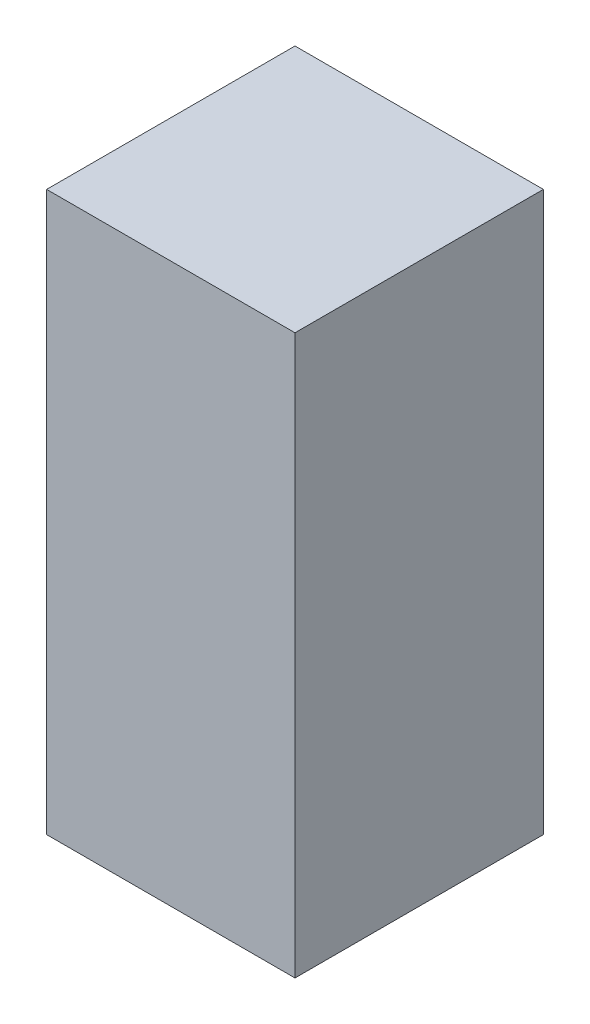
ISO-10303-21;
HEADER;
FILE_DESCRIPTION(('STEP AP214'),'2;1');
FILE_NAME('part.step','',(''),(''),'','','');
FILE_SCHEMA(('AUTOMOTIVE_DESIGN { 1 0 10303 214 1 1 1 1 }'));
ENDSEC;
DATA;
#1=APPLICATION_CONTEXT('core data for automotive mechanical design processes');
#2=APPLICATION_PROTOCOL_DEFINITION('international standard','automotive_design',2000,#1);
#3=PRODUCT_CONTEXT('',#1,'mechanical');
#4=PRODUCT('Part','Part','',(#3));
#5=PRODUCT_RELATED_PRODUCT_CATEGORY('part','',(#4));
#6=PRODUCT_DEFINITION_FORMATION('','',#4);
#7=PRODUCT_DEFINITION_CONTEXT('part definition',#1,'design');
#8=PRODUCT_DEFINITION('design','',#6,#7);
#9=PRODUCT_DEFINITION_SHAPE('','',#8);
#10=(LENGTH_UNIT() NAMED_UNIT(*) SI_UNIT(.MILLI.,.METRE.));
#11=(NAMED_UNIT(*) PLANE_ANGLE_UNIT() SI_UNIT($,.RADIAN.));
#12=(NAMED_UNIT(*) SI_UNIT($,.STERADIAN.) SOLID_ANGLE_UNIT());
#13=UNCERTAINTY_MEASURE_WITH_UNIT(LENGTH_MEASURE(1.E-05),#10,'distance_accuracy_value','');
#14=(GEOMETRIC_REPRESENTATION_CONTEXT(3) GLOBAL_UNCERTAINTY_ASSIGNED_CONTEXT((#13)) GLOBAL_UNIT_ASSIGNED_CONTEXT((#10,
#11,#12)) REPRESENTATION_CONTEXT('',''));
#15=CARTESIAN_POINT('',(0.,0.,0.));
#16=DIRECTION('',(0.,0.,1.));
#17=DIRECTION('',(1.,0.,0.));
#18=AXIS2_PLACEMENT_3D('',#15,#16,#17);
#19=CARTESIAN_POINT('',(-50.,225.,50.));
#20=DIRECTION('',(1.,0.,0.));
#21=DIRECTION('',(0.,0.,-1.));
#22=AXIS2_PLACEMENT_3D('',#19,#20,#21);
#23=PLANE('',#22);
#24=DIRECTION('',(0.,0.,1.));
#25=VECTOR('',#24,1.);
#26=CARTESIAN_POINT('',(-50.,0.,50.));
#27=LINE('',#26,#25);
#28=CARTESIAN_POINT('',(-50.,0.,-50.));
#29=VERTEX_POINT('',#28);
#30=CARTESIAN_POINT('',(-50.,0.,50.));
#31=VERTEX_POINT('',#30);
#32=EDGE_CURVE('E107',#29,#31,#27,.T.);
#33=ORIENTED_EDGE('',*,*,#32,.T.);
#34=DIRECTION('',(0.,-1.,0.));
#35=VECTOR('',#34,1.);
#36=CARTESIAN_POINT('',(-50.,225.,50.));
#37=LINE('',#36,#35);
#38=CARTESIAN_POINT('',(-50.,225.,50.));
#39=VERTEX_POINT('',#38);
#40=EDGE_CURVE('E11',#39,#31,#37,.T.);
#41=ORIENTED_EDGE('',*,*,#40,.F.);
#42=DIRECTION('',(0.,0.,1.));
#43=VECTOR('',#42,1.);
#44=CARTESIAN_POINT('',(-50.,225.,50.));
#45=LINE('',#44,#43);
#46=CARTESIAN_POINT('',(-50.,225.,-50.));
#47=VERTEX_POINT('',#46);
#48=EDGE_CURVE('E91',#47,#39,#45,.T.);
#49=ORIENTED_EDGE('',*,*,#48,.F.);
#50=DIRECTION('',(0.,-1.,0.));
#51=VECTOR('',#50,1.);
#52=CARTESIAN_POINT('',(-50.,225.,-50.));
#53=LINE('',#52,#51);
#54=EDGE_CURVE('E103',#47,#29,#53,.T.);
#55=ORIENTED_EDGE('',*,*,#54,.T.);
#56=EDGE_LOOP('',(#33,#41,#49,#55));
#57=FACE_BOUND('',#56,.T.);
#58=ADVANCED_FACE('F39',(#57),#23,.F.);
#59=CARTESIAN_POINT('',(50.,225.,50.));
#60=DIRECTION('',(0.,0.,-1.));
#61=DIRECTION('',(-1.,0.,0.));
#62=AXIS2_PLACEMENT_3D('',#59,#60,#61);
#63=PLANE('',#62);
#64=DIRECTION('',(1.,0.,0.));
#65=VECTOR('',#64,1.);
#66=CARTESIAN_POINT('',(50.,0.,50.));
#67=LINE('',#66,#65);
#68=CARTESIAN_POINT('',(50.,0.,50.));
#69=VERTEX_POINT('',#68);
#70=EDGE_CURVE('E96',#31,#69,#67,.T.);
#71=ORIENTED_EDGE('',*,*,#70,.T.);
#72=DIRECTION('',(0.,-1.,0.));
#73=VECTOR('',#72,1.);
#74=CARTESIAN_POINT('',(50.,225.,50.));
#75=LINE('',#74,#73);
#76=CARTESIAN_POINT('',(50.,225.,50.));
#77=VERTEX_POINT('',#76);
#78=EDGE_CURVE('E48',#77,#69,#75,.T.);
#79=ORIENTED_EDGE('',*,*,#78,.F.);
#80=DIRECTION('',(1.,0.,0.));
#81=VECTOR('',#80,1.);
#82=CARTESIAN_POINT('',(50.,225.,50.));
#83=LINE('',#82,#81);
#84=EDGE_CURVE('E86',#39,#77,#83,.T.);
#85=ORIENTED_EDGE('',*,*,#84,.F.);
#86=ORIENTED_EDGE('',*,*,#40,.T.);
#87=EDGE_LOOP('',(#71,#79,#85,#86));
#88=FACE_BOUND('',#87,.T.);
#89=ADVANCED_FACE('F95',(#88),#63,.F.);
#90=CARTESIAN_POINT('',(50.,225.,50.));
#91=DIRECTION('',(-1.,0.,0.));
#92=DIRECTION('',(0.,0.,1.));
#93=AXIS2_PLACEMENT_3D('',#90,#91,#92);
#94=PLANE('',#93);
#95=DIRECTION('',(0.,0.,-1.));
#96=VECTOR('',#95,1.);
#97=CARTESIAN_POINT('',(50.,0.,50.));
#98=LINE('',#97,#96);
#99=CARTESIAN_POINT('',(50.,0.,-50.));
#100=VERTEX_POINT('',#99);
#101=EDGE_CURVE('E73',#69,#100,#98,.T.);
#102=ORIENTED_EDGE('',*,*,#101,.T.);
#103=DIRECTION('',(0.,-1.,0.));
#104=VECTOR('',#103,1.);
#105=CARTESIAN_POINT('',(50.,225.,-50.));
#106=LINE('',#105,#104);
#107=CARTESIAN_POINT('',(50.,225.,-50.));
#108=VERTEX_POINT('',#107);
#109=EDGE_CURVE('E98',#108,#100,#106,.T.);
#110=ORIENTED_EDGE('',*,*,#109,.F.);
#111=DIRECTION('',(0.,0.,-1.));
#112=VECTOR('',#111,1.);
#113=CARTESIAN_POINT('',(50.,225.,50.));
#114=LINE('',#113,#112);
#115=EDGE_CURVE('E89',#77,#108,#114,.T.);
#116=ORIENTED_EDGE('',*,*,#115,.F.);
#117=ORIENTED_EDGE('',*,*,#78,.T.);
#118=EDGE_LOOP('',(#102,#110,#116,#117));
#119=FACE_BOUND('',#118,.T.);
#120=ADVANCED_FACE('F99',(#119),#94,.F.);
#121=CARTESIAN_POINT('',(50.,225.,-50.));
#122=DIRECTION('',(0.,0.,1.));
#123=DIRECTION('',(1.,0.,0.));
#124=AXIS2_PLACEMENT_3D('',#121,#122,#123);
#125=PLANE('',#124);
#126=DIRECTION('',(-1.,0.,0.));
#127=VECTOR('',#126,1.);
#128=CARTESIAN_POINT('',(50.,0.,-50.));
#129=LINE('',#128,#127);
#130=EDGE_CURVE('E79',#100,#29,#129,.T.);
#131=ORIENTED_EDGE('',*,*,#130,.T.);
#132=ORIENTED_EDGE('',*,*,#54,.F.);
#133=DIRECTION('',(-1.,0.,0.));
#134=VECTOR('',#133,1.);
#135=CARTESIAN_POINT('',(50.,225.,-50.));
#136=LINE('',#135,#134);
#137=EDGE_CURVE('E56',#108,#47,#136,.T.);
#138=ORIENTED_EDGE('',*,*,#137,.F.);
#139=ORIENTED_EDGE('',*,*,#109,.T.);
#140=EDGE_LOOP('',(#131,#132,#138,#139));
#141=FACE_BOUND('',#140,.T.);
#142=ADVANCED_FACE('F120',(#141),#125,.F.);
#143=CARTESIAN_POINT('',(0.,225.,0.));
#144=DIRECTION('',(0.,1.,0.));
#145=DIRECTION('',(0.,0.,1.));
#146=AXIS2_PLACEMENT_3D('',#143,#144,#145);
#147=PLANE('',#146);
#148=ORIENTED_EDGE('',*,*,#48,.T.);
#149=ORIENTED_EDGE('',*,*,#84,.T.);
#150=ORIENTED_EDGE('',*,*,#115,.T.);
#151=ORIENTED_EDGE('',*,*,#137,.T.);
#152=EDGE_LOOP('',(#148,#149,#150,#151));
#153=FACE_BOUND('',#152,.T.);
#154=ADVANCED_FACE('F87',(#153),#147,.T.);
#155=CARTESIAN_POINT('',(0.,0.,0.));
#156=DIRECTION('',(0.,1.,0.));
#157=DIRECTION('',(0.,0.,1.));
#158=AXIS2_PLACEMENT_3D('',#155,#156,#157);
#159=PLANE('',#158);
#160=ORIENTED_EDGE('',*,*,#32,.F.);
#161=ORIENTED_EDGE('',*,*,#130,.F.);
#162=ORIENTED_EDGE('',*,*,#101,.F.);
#163=ORIENTED_EDGE('',*,*,#70,.F.);
#164=EDGE_LOOP('',(#160,#161,#162,#163));
#165=FACE_BOUND('',#164,.T.);
#166=ADVANCED_FACE('F123',(#165),#159,.F.);
#167=CLOSED_SHELL('',(#58,#89,#120,#142,#154,#166));
#168=MANIFOLD_SOLID_BREP('B2',#167);
#169=ADVANCED_BREP_SHAPE_REPRESENTATION('',(#18,#168),#14);
#170=SHAPE_DEFINITION_REPRESENTATION(#9,#169);
ENDSEC;
END-ISO-10303-21;
